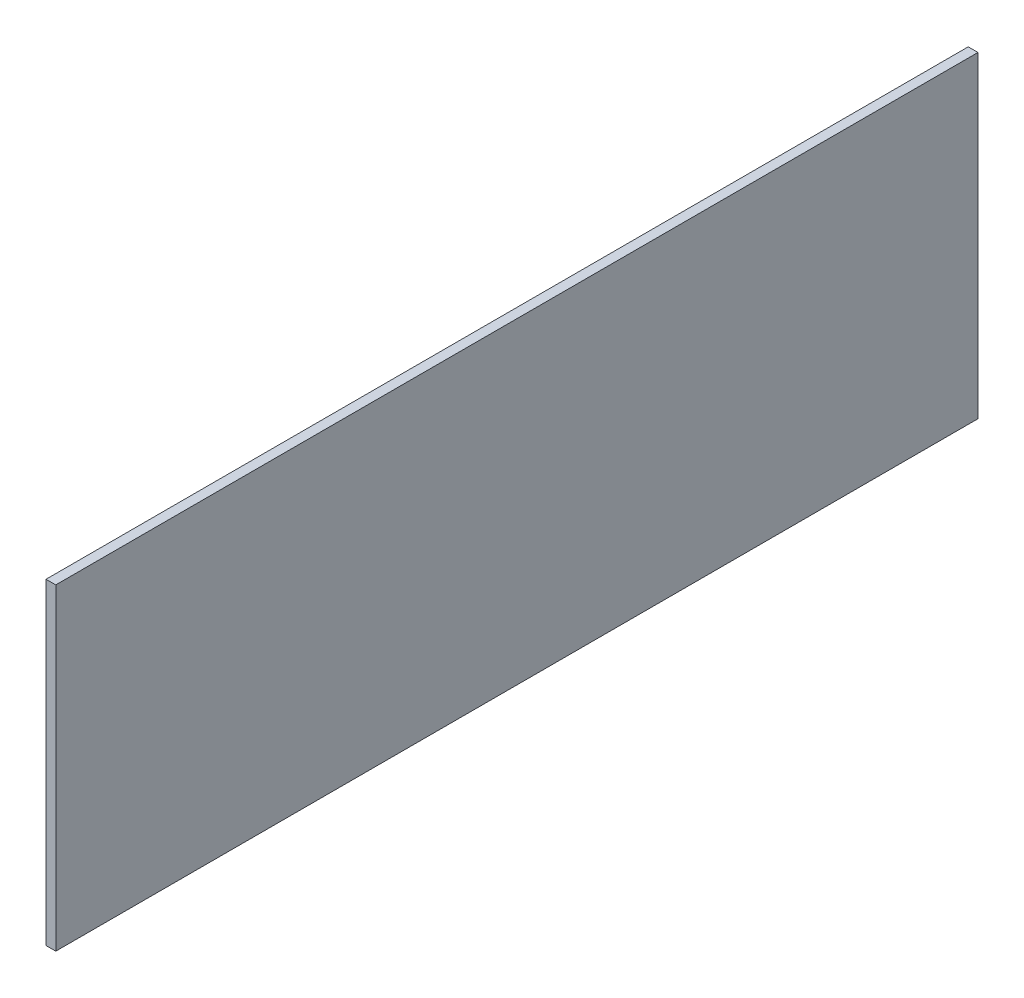
ISO-10303-21;
HEADER;
FILE_DESCRIPTION(('STEP AP214'),'2;1');
FILE_NAME('part.step','',(''),(''),'','','');
FILE_SCHEMA(('AUTOMOTIVE_DESIGN { 1 0 10303 214 1 1 1 1 }'));
ENDSEC;
DATA;
#1=APPLICATION_CONTEXT('core data for automotive mechanical design processes');
#2=APPLICATION_PROTOCOL_DEFINITION('international standard','automotive_design',2000,#1);
#3=PRODUCT_CONTEXT('',#1,'mechanical');
#4=PRODUCT('Part','Part','',(#3));
#5=PRODUCT_RELATED_PRODUCT_CATEGORY('part','',(#4));
#6=PRODUCT_DEFINITION_FORMATION('','',#4);
#7=PRODUCT_DEFINITION_CONTEXT('part definition',#1,'design');
#8=PRODUCT_DEFINITION('design','',#6,#7);
#9=PRODUCT_DEFINITION_SHAPE('','',#8);
#10=(LENGTH_UNIT() NAMED_UNIT(*) SI_UNIT(.MILLI.,.METRE.));
#11=(NAMED_UNIT(*) PLANE_ANGLE_UNIT() SI_UNIT($,.RADIAN.));
#12=(NAMED_UNIT(*) SI_UNIT($,.STERADIAN.) SOLID_ANGLE_UNIT());
#13=UNCERTAINTY_MEASURE_WITH_UNIT(LENGTH_MEASURE(1.E-05),#10,'distance_accuracy_value','');
#14=(GEOMETRIC_REPRESENTATION_CONTEXT(3) GLOBAL_UNCERTAINTY_ASSIGNED_CONTEXT((#13)) GLOBAL_UNIT_ASSIGNED_CONTEXT((#10,
#11,#12)) REPRESENTATION_CONTEXT('',''));
#15=CARTESIAN_POINT('',(0.,0.,0.));
#16=DIRECTION('',(0.,0.,1.));
#17=DIRECTION('',(1.,0.,0.));
#18=AXIS2_PLACEMENT_3D('',#15,#16,#17);
#19=CARTESIAN_POINT('',(7463.60713300495,3575.07767023142,107.95));
#20=DIRECTION('',(0.,-1.,0.));
#21=DIRECTION('',(0.,0.,-1.));
#22=AXIS2_PLACEMENT_3D('',#19,#20,#21);
#23=PLANE('',#22);
#24=DIRECTION('',(-1.,0.,0.));
#25=VECTOR('',#24,1.);
#26=CARTESIAN_POINT('',(7463.60713300495,3575.07767023142,0.));
#27=LINE('',#26,#25);
#28=CARTESIAN_POINT('',(7463.60713300495,3575.07767023142,0.));
#29=VERTEX_POINT('',#28);
#30=CARTESIAN_POINT('',(7462.46413300495,3575.07767023142,0.));
#31=VERTEX_POINT('',#30);
#32=EDGE_CURVE('E100',#29,#31,#27,.T.);
#33=ORIENTED_EDGE('',*,*,#32,.T.);
#34=DIRECTION('',(0.,0.,-1.));
#35=VECTOR('',#34,1.);
#36=CARTESIAN_POINT('',(7462.46413300495,3575.07767023142,107.95));
#37=LINE('',#36,#35);
#38=CARTESIAN_POINT('',(7462.46413300495,3575.07767023142,107.95));
#39=VERTEX_POINT('',#38);
#40=EDGE_CURVE('E11',#39,#31,#37,.T.);
#41=ORIENTED_EDGE('',*,*,#40,.F.);
#42=DIRECTION('',(-1.,0.,0.));
#43=VECTOR('',#42,1.);
#44=CARTESIAN_POINT('',(7463.60713300495,3575.07767023142,107.95));
#45=LINE('',#44,#43);
#46=CARTESIAN_POINT('',(7463.60713300495,3575.07767023142,107.95));
#47=VERTEX_POINT('',#46);
#48=EDGE_CURVE('E88',#47,#39,#45,.T.);
#49=ORIENTED_EDGE('',*,*,#48,.F.);
#50=DIRECTION('',(0.,0.,-1.));
#51=VECTOR('',#50,1.);
#52=CARTESIAN_POINT('',(7463.60713300495,3575.07767023142,107.95));
#53=LINE('',#52,#51);
#54=EDGE_CURVE('E96',#47,#29,#53,.T.);
#55=ORIENTED_EDGE('',*,*,#54,.T.);
#56=EDGE_LOOP('',(#33,#41,#49,#55));
#57=FACE_BOUND('',#56,.T.);
#58=ADVANCED_FACE('F37',(#57),#23,.F.);
#59=CARTESIAN_POINT('',(7462.46413300495,3575.07767023142,107.95));
#60=DIRECTION('',(1.,0.,0.));
#61=DIRECTION('',(0.,0.,-1.));
#62=AXIS2_PLACEMENT_3D('',#59,#60,#61);
#63=PLANE('',#62);
#64=DIRECTION('',(0.,-1.,0.));
#65=VECTOR('',#64,1.);
#66=CARTESIAN_POINT('',(7462.46413300495,3575.07767023142,0.));
#67=LINE('',#66,#65);
#68=CARTESIAN_POINT('',(7462.46413300495,3537.94470308847,0.));
#69=VERTEX_POINT('',#68);
#70=EDGE_CURVE('E92',#31,#69,#67,.T.);
#71=ORIENTED_EDGE('',*,*,#70,.T.);
#72=DIRECTION('',(0.,0.,-1.));
#73=VECTOR('',#72,1.);
#74=CARTESIAN_POINT('',(7462.46413300495,3537.94470308847,107.95));
#75=LINE('',#74,#73);
#76=CARTESIAN_POINT('',(7462.46413300495,3537.94470308847,107.95));
#77=VERTEX_POINT('',#76);
#78=EDGE_CURVE('E45',#77,#69,#75,.T.);
#79=ORIENTED_EDGE('',*,*,#78,.F.);
#80=DIRECTION('',(0.,-1.,0.));
#81=VECTOR('',#80,1.);
#82=CARTESIAN_POINT('',(7462.46413300495,3575.07767023142,107.95));
#83=LINE('',#82,#81);
#84=EDGE_CURVE('E83',#39,#77,#83,.T.);
#85=ORIENTED_EDGE('',*,*,#84,.F.);
#86=ORIENTED_EDGE('',*,*,#40,.T.);
#87=EDGE_LOOP('',(#71,#79,#85,#86));
#88=FACE_BOUND('',#87,.T.);
#89=ADVANCED_FACE('F91',(#88),#63,.F.);
#90=CARTESIAN_POINT('',(7463.60713300495,3537.94470308847,107.95));
#91=DIRECTION('',(0.,1.,0.));
#92=DIRECTION('',(0.,0.,1.));
#93=AXIS2_PLACEMENT_3D('',#90,#91,#92);
#94=PLANE('',#93);
#95=DIRECTION('',(1.,0.,0.));
#96=VECTOR('',#95,1.);
#97=CARTESIAN_POINT('',(7463.60713300495,3537.94470308847,0.));
#98=LINE('',#97,#96);
#99=CARTESIAN_POINT('',(7463.60713300495,3537.94470308847,0.));
#100=VERTEX_POINT('',#99);
#101=EDGE_CURVE('E70',#69,#100,#98,.T.);
#102=ORIENTED_EDGE('',*,*,#101,.T.);
#103=DIRECTION('',(0.,0.,-1.));
#104=VECTOR('',#103,1.);
#105=CARTESIAN_POINT('',(7463.60713300495,3537.94470308847,107.95));
#106=LINE('',#105,#104);
#107=CARTESIAN_POINT('',(7463.60713300495,3537.94470308847,107.95));
#108=VERTEX_POINT('',#107);
#109=EDGE_CURVE('E93',#108,#100,#106,.T.);
#110=ORIENTED_EDGE('',*,*,#109,.F.);
#111=DIRECTION('',(1.,0.,0.));
#112=VECTOR('',#111,1.);
#113=CARTESIAN_POINT('',(7463.60713300495,3537.94470308847,107.95));
#114=LINE('',#113,#112);
#115=EDGE_CURVE('E86',#77,#108,#114,.T.);
#116=ORIENTED_EDGE('',*,*,#115,.F.);
#117=ORIENTED_EDGE('',*,*,#78,.T.);
#118=EDGE_LOOP('',(#102,#110,#116,#117));
#119=FACE_BOUND('',#118,.T.);
#120=ADVANCED_FACE('F94',(#119),#94,.F.);
#121=CARTESIAN_POINT('',(7463.60713300495,3575.07767023142,107.95));
#122=DIRECTION('',(-1.,0.,0.));
#123=DIRECTION('',(0.,-1.,0.));
#124=AXIS2_PLACEMENT_3D('',#121,#122,#123);
#125=PLANE('',#124);
#126=DIRECTION('',(0.,1.,0.));
#127=VECTOR('',#126,1.);
#128=CARTESIAN_POINT('',(7463.60713300495,3575.07767023142,0.));
#129=LINE('',#128,#127);
#130=EDGE_CURVE('E76',#100,#29,#129,.T.);
#131=ORIENTED_EDGE('',*,*,#130,.T.);
#132=ORIENTED_EDGE('',*,*,#54,.F.);
#133=DIRECTION('',(0.,1.,0.));
#134=VECTOR('',#133,1.);
#135=CARTESIAN_POINT('',(7463.60713300495,3575.07767023142,107.95));
#136=LINE('',#135,#134);
#137=EDGE_CURVE('E53',#108,#47,#136,.T.);
#138=ORIENTED_EDGE('',*,*,#137,.F.);
#139=ORIENTED_EDGE('',*,*,#109,.T.);
#140=EDGE_LOOP('',(#131,#132,#138,#139));
#141=FACE_BOUND('',#140,.T.);
#142=ADVANCED_FACE('F107',(#141),#125,.F.);
#143=CARTESIAN_POINT('',(0.,0.,107.95));
#144=DIRECTION('',(0.,0.,1.));
#145=DIRECTION('',(1.,0.,0.));
#146=AXIS2_PLACEMENT_3D('',#143,#144,#145);
#147=PLANE('',#146);
#148=ORIENTED_EDGE('',*,*,#48,.T.);
#149=ORIENTED_EDGE('',*,*,#84,.T.);
#150=ORIENTED_EDGE('',*,*,#115,.T.);
#151=ORIENTED_EDGE('',*,*,#137,.T.);
#152=EDGE_LOOP('',(#148,#149,#150,#151));
#153=FACE_BOUND('',#152,.T.);
#154=ADVANCED_FACE('F84',(#153),#147,.T.);
#155=CARTESIAN_POINT('',(0.,0.,0.));
#156=DIRECTION('',(0.,0.,1.));
#157=DIRECTION('',(1.,0.,0.));
#158=AXIS2_PLACEMENT_3D('',#155,#156,#157);
#159=PLANE('',#158);
#160=ORIENTED_EDGE('',*,*,#32,.F.);
#161=ORIENTED_EDGE('',*,*,#130,.F.);
#162=ORIENTED_EDGE('',*,*,#101,.F.);
#163=ORIENTED_EDGE('',*,*,#70,.F.);
#164=EDGE_LOOP('',(#160,#161,#162,#163));
#165=FACE_BOUND('',#164,.T.);
#166=ADVANCED_FACE('F110',(#165),#159,.F.);
#167=CLOSED_SHELL('',(#58,#89,#120,#142,#154,#166));
#168=MANIFOLD_SOLID_BREP('B2',#167);
#169=ADVANCED_BREP_SHAPE_REPRESENTATION('',(#18,#168),#14);
#170=SHAPE_DEFINITION_REPRESENTATION(#9,#169);
ENDSEC;
END-ISO-10303-21;
